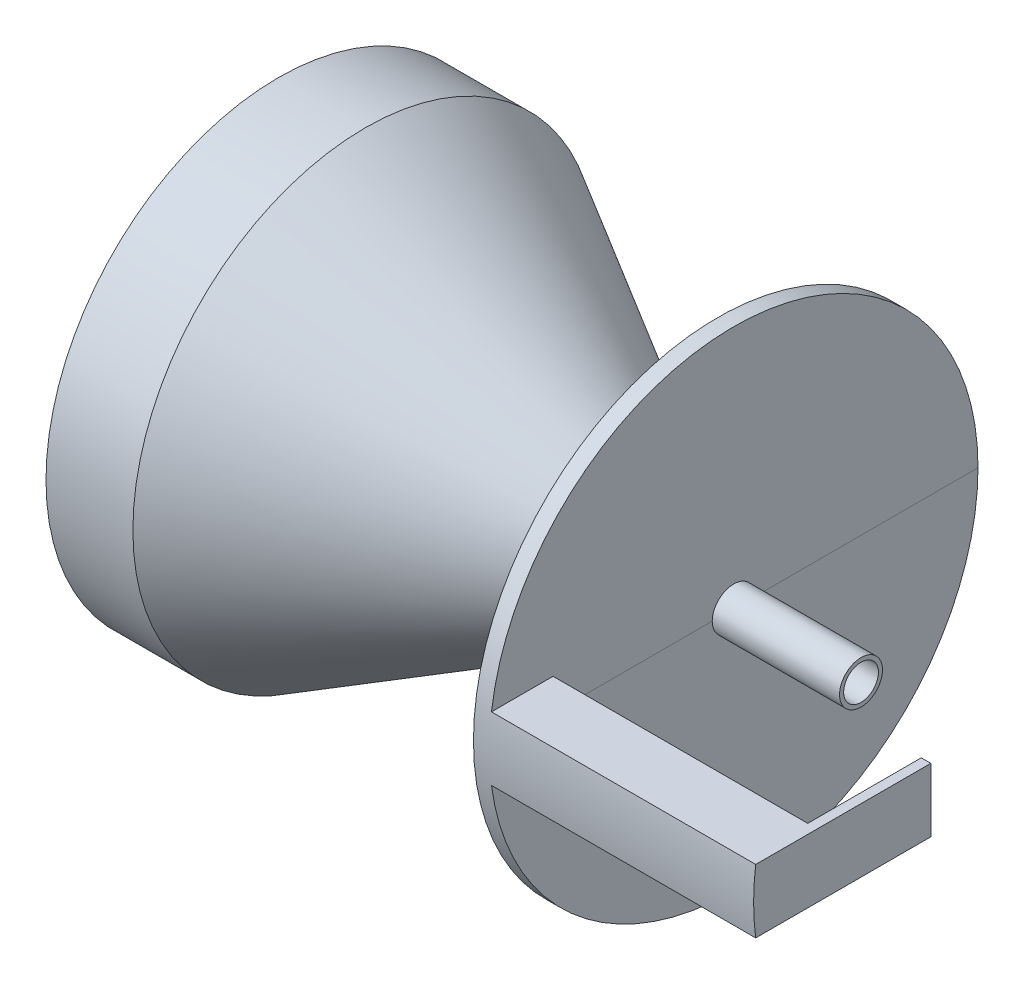
ISO-10303-21;
HEADER;
FILE_DESCRIPTION(('STEP AP214'),'2;1');
FILE_NAME('part.step','',(''),(''),'','','');
FILE_SCHEMA(('AUTOMOTIVE_DESIGN { 1 0 10303 214 1 1 1 1 }'));
ENDSEC;
DATA;
#1=APPLICATION_CONTEXT('core data for automotive mechanical design processes');
#2=APPLICATION_PROTOCOL_DEFINITION('international standard','automotive_design',2000,#1);
#3=PRODUCT_CONTEXT('',#1,'mechanical');
#4=PRODUCT('Part','Part','',(#3));
#5=PRODUCT_RELATED_PRODUCT_CATEGORY('part','',(#4));
#6=PRODUCT_DEFINITION_FORMATION('','',#4);
#7=PRODUCT_DEFINITION_CONTEXT('part definition',#1,'design');
#8=PRODUCT_DEFINITION('design','',#6,#7);
#9=PRODUCT_DEFINITION_SHAPE('','',#8);
#10=(LENGTH_UNIT() NAMED_UNIT(*) SI_UNIT(.MILLI.,.METRE.));
#11=(NAMED_UNIT(*) PLANE_ANGLE_UNIT() SI_UNIT($,.RADIAN.));
#12=(NAMED_UNIT(*) SI_UNIT($,.STERADIAN.) SOLID_ANGLE_UNIT());
#13=UNCERTAINTY_MEASURE_WITH_UNIT(LENGTH_MEASURE(1.E-05),#10,'distance_accuracy_value','');
#14=(GEOMETRIC_REPRESENTATION_CONTEXT(3) GLOBAL_UNCERTAINTY_ASSIGNED_CONTEXT((#13)) GLOBAL_UNIT_ASSIGNED_CONTEXT((#10,
#11,#12)) REPRESENTATION_CONTEXT('',''));
#15=CARTESIAN_POINT('',(0.,0.,0.));
#16=DIRECTION('',(0.,0.,1.));
#17=DIRECTION('',(1.,0.,0.));
#18=AXIS2_PLACEMENT_3D('',#15,#16,#17);
#19=CARTESIAN_POINT('',(143.,0.,6.73913217343127));
#20=DIRECTION('',(1.,0.,0.));
#21=DIRECTION('',(0.,0.,-1.));
#22=AXIS2_PLACEMENT_3D('',#19,#20,#21);
#23=PLANE('',#22);
#24=DIRECTION('',(0.,0.,1.));
#25=VECTOR('',#24,1.);
#26=CARTESIAN_POINT('',(143.,0.,6.73913217343127));
#27=LINE('',#26,#25);
#28=CARTESIAN_POINT('',(143.,0.,6.73913217343127));
#29=VERTEX_POINT('',#28);
#30=CARTESIAN_POINT('',(143.,0.,56.7391321734313));
#31=VERTEX_POINT('',#30);
#32=EDGE_CURVE('E198',#29,#31,#27,.T.);
#33=ORIENTED_EDGE('',*,*,#32,.T.);
#34=DIRECTION('',(0.,1.,0.));
#35=VECTOR('',#34,1.);
#36=CARTESIAN_POINT('',(143.,0.,56.7391321734313));
#37=LINE('',#36,#35);
#38=CARTESIAN_POINT('',(143.,-10.,56.7391321734313));
#39=VERTEX_POINT('',#38);
#40=EDGE_CURVE('E71',#39,#31,#37,.T.);
#41=ORIENTED_EDGE('',*,*,#40,.F.);
#42=DIRECTION('',(0.,0.,-1.));
#43=VECTOR('',#42,1.);
#44=CARTESIAN_POINT('',(143.,-10.,56.7391321734313));
#45=LINE('',#44,#43);
#46=CARTESIAN_POINT('',(143.,-10.,76.0847843312403));
#47=VERTEX_POINT('',#46);
#48=EDGE_CURVE('E182',#47,#39,#45,.T.);
#49=ORIENTED_EDGE('',*,*,#48,.F.);
#50=CARTESIAN_POINT('',(143.,0.,0.));
#51=DIRECTION('',(1.,0.,0.));
#52=DIRECTION('',(0.,0.,1.));
#53=AXIS2_PLACEMENT_3D('',#50,#51,#52);
#54=CIRCLE('',#53,76.7391321734313);
#55=CARTESIAN_POINT('',(143.,0.,-76.7391321734313));
#56=VERTEX_POINT('',#55);
#57=EDGE_CURVE('E143',#47,#56,#54,.T.);
#58=ORIENTED_EDGE('',*,*,#57,.T.);
#59=DIRECTION('',(0.,0.,-1.));
#60=VECTOR('',#59,1.);
#61=CARTESIAN_POINT('',(143.,0.,-6.73913217343127));
#62=LINE('',#61,#60);
#63=CARTESIAN_POINT('',(143.,0.,-6.73913217343127));
#64=VERTEX_POINT('',#63);
#65=EDGE_CURVE('E194',#64,#56,#62,.T.);
#66=ORIENTED_EDGE('',*,*,#65,.F.);
#67=CARTESIAN_POINT('',(143.,0.,0.));
#68=DIRECTION('',(1.,0.,0.));
#69=DIRECTION('',(0.,0.,1.));
#70=AXIS2_PLACEMENT_3D('',#67,#68,#69);
#71=CIRCLE('',#70,6.73913217343127);
#72=EDGE_CURVE('E200',#29,#64,#71,.T.);
#73=ORIENTED_EDGE('',*,*,#72,.F.);
#74=EDGE_LOOP('',(#33,#41,#49,#58,#66,#73));
#75=FACE_BOUND('',#74,.T.);
#76=ADVANCED_FACE('F48',(#75),#23,.T.);
#77=CARTESIAN_POINT('',(143.,0.,-6.73913217343127));
#78=DIRECTION('',(1.,0.,0.));
#79=DIRECTION('',(0.,0.,-1.));
#80=AXIS2_PLACEMENT_3D('',#77,#78,#79);
#81=PLANE('',#80);
#82=DIRECTION('',(0.,0.,1.));
#83=VECTOR('',#82,1.);
#84=CARTESIAN_POINT('',(143.,10.,56.7391321734313));
#85=LINE('',#84,#83);
#86=CARTESIAN_POINT('',(143.,10.,56.7391321734313));
#87=VERTEX_POINT('',#86);
#88=CARTESIAN_POINT('',(143.,10.,76.0847843312403));
#89=VERTEX_POINT('',#88);
#90=EDGE_CURVE('E184',#87,#89,#85,.T.);
#91=ORIENTED_EDGE('',*,*,#90,.F.);
#92=DIRECTION('',(0.,-1.,0.));
#93=VECTOR('',#92,1.);
#94=CARTESIAN_POINT('',(143.,0.,56.7391321734313));
#95=LINE('',#94,#93);
#96=EDGE_CURVE('E12',#87,#31,#95,.T.);
#97=ORIENTED_EDGE('',*,*,#96,.T.);
#98=ORIENTED_EDGE('',*,*,#32,.F.);
#99=CARTESIAN_POINT('',(143.,0.,0.));
#100=DIRECTION('',(-1.,0.,0.));
#101=DIRECTION('',(0.,0.,1.));
#102=AXIS2_PLACEMENT_3D('',#99,#100,#101);
#103=CIRCLE('',#102,6.73913217343127);
#104=EDGE_CURVE('E234',#29,#64,#103,.T.);
#105=ORIENTED_EDGE('',*,*,#104,.T.);
#106=ORIENTED_EDGE('',*,*,#65,.T.);
#107=CARTESIAN_POINT('',(143.,0.,0.));
#108=DIRECTION('',(1.,0.,0.));
#109=DIRECTION('',(0.,0.,-1.));
#110=AXIS2_PLACEMENT_3D('',#107,#108,#109);
#111=CIRCLE('',#110,76.7391321734313);
#112=EDGE_CURVE('E210',#56,#89,#111,.T.);
#113=ORIENTED_EDGE('',*,*,#112,.T.);
#114=EDGE_LOOP('',(#91,#97,#98,#105,#106,#113));
#115=FACE_BOUND('',#114,.T.);
#116=ADVANCED_FACE('F277',(#115),#81,.T.);
#117=CARTESIAN_POINT('',(141.490801074267,0.,0.));
#118=DIRECTION('',(-1.,0.,0.));
#119=DIRECTION('',(0.,0.,1.));
#120=AXIS2_PLACEMENT_3D('',#117,#118,#119);
#121=CONICAL_SURFACE('',#120,7.60336554424563,0.520061711616792);
#122=CARTESIAN_POINT('',(138.,0.,0.));
#123=DIRECTION('',(1.,0.,0.));
#124=DIRECTION('',(0.,0.,-1.));
#125=AXIS2_PLACEMENT_3D('',#122,#123,#124);
#126=CIRCLE('',#125,9.60235105093749);
#127=CARTESIAN_POINT('',(138.,0.,-9.60235105093751));
#128=VERTEX_POINT('',#127);
#129=CARTESIAN_POINT('',(138.,0.,9.60235105093749));
#130=VERTEX_POINT('',#129);
#131=EDGE_CURVE('E195',#128,#130,#126,.T.);
#132=ORIENTED_EDGE('',*,*,#131,.F.);
#133=CARTESIAN_POINT('',(138.,0.,0.));
#134=DIRECTION('',(1.,0.,0.));
#135=DIRECTION('',(0.,0.,1.));
#136=AXIS2_PLACEMENT_3D('',#133,#134,#135);
#137=CIRCLE('',#136,9.60235105093749);
#138=EDGE_CURVE('E202',#130,#128,#137,.T.);
#139=ORIENTED_EDGE('',*,*,#138,.F.);
#140=EDGE_LOOP('',(#132,#139));
#141=FACE_BOUND('',#140,.T.);
#142=CARTESIAN_POINT('',(27.2895519669807,0.,0.));
#143=DIRECTION('',(-1.,0.,0.));
#144=DIRECTION('',(0.,0.,1.));
#145=AXIS2_PLACEMENT_3D('',#142,#143,#144);
#146=CIRCLE('',#145,73.);
#147=CARTESIAN_POINT('',(27.2895519669807,0.,73.));
#148=VERTEX_POINT('',#147);
#149=EDGE_CURVE('E249',#148,#148,#146,.T.);
#150=ORIENTED_EDGE('',*,*,#149,.F.);
#151=EDGE_LOOP('',(#150));
#152=FACE_BOUND('',#151,.T.);
#153=ADVANCED_FACE('F282',(#141,#152),#121,.T.);
#154=CARTESIAN_POINT('',(0.,0.,0.));
#155=DIRECTION('',(-1.,0.,0.));
#156=DIRECTION('',(0.,0.,1.));
#157=AXIS2_PLACEMENT_3D('',#154,#155,#156);
#158=PLANE('',#157);
#159=CARTESIAN_POINT('',(0.,0.,0.));
#160=DIRECTION('',(-1.,0.,0.));
#161=DIRECTION('',(0.,0.,1.));
#162=AXIS2_PLACEMENT_3D('',#159,#160,#161);
#163=CIRCLE('',#162,70.);
#164=CARTESIAN_POINT('',(0.,0.,70.));
#165=VERTEX_POINT('',#164);
#166=EDGE_CURVE('E246',#165,#165,#163,.T.);
#167=ORIENTED_EDGE('',*,*,#166,.F.);
#168=EDGE_LOOP('',(#167));
#169=FACE_BOUND('',#168,.T.);
#170=CARTESIAN_POINT('',(0.,0.,0.));
#171=DIRECTION('',(-1.,0.,0.));
#172=DIRECTION('',(0.,0.,1.));
#173=AXIS2_PLACEMENT_3D('',#170,#171,#172);
#174=CIRCLE('',#173,73.);
#175=CARTESIAN_POINT('',(0.,0.,73.));
#176=VERTEX_POINT('',#175);
#177=EDGE_CURVE('E57',#176,#176,#174,.T.);
#178=ORIENTED_EDGE('',*,*,#177,.T.);
#179=EDGE_LOOP('',(#178));
#180=FACE_BOUND('',#179,.T.);
#181=ADVANCED_FACE('F500',(#169,#180),#158,.T.);
#182=CARTESIAN_POINT('',(0.,0.,0.));
#183=DIRECTION('',(-1.,0.,0.));
#184=DIRECTION('',(0.,0.,1.));
#185=AXIS2_PLACEMENT_3D('',#182,#183,#184);
#186=CYLINDRICAL_SURFACE('',#185,73.);
#187=ORIENTED_EDGE('',*,*,#177,.F.);
#188=EDGE_LOOP('',(#187));
#189=FACE_BOUND('',#188,.T.);
#190=ORIENTED_EDGE('',*,*,#149,.T.);
#191=EDGE_LOOP('',(#190));
#192=FACE_BOUND('',#191,.T.);
#193=ADVANCED_FACE('F50',(#189,#192),#186,.T.);
#194=CARTESIAN_POINT('',(140.,0.,0.));
#195=DIRECTION('',(-1.,0.,0.));
#196=DIRECTION('',(0.,0.,1.));
#197=AXIS2_PLACEMENT_3D('',#194,#195,#196);
#198=CONICAL_SURFACE('',#197,5.,0.520061711616792);
#199=CARTESIAN_POINT('',(139.333109308548,0.,0.));
#200=DIRECTION('',(-1.,0.,0.));
#201=DIRECTION('',(0.,0.,1.));
#202=AXIS2_PLACEMENT_3D('',#199,#200,#201);
#203=CIRCLE('',#202,5.38189080339985);
#204=CARTESIAN_POINT('',(139.333109308548,0.,5.38189080339983));
#205=VERTEX_POINT('',#204);
#206=EDGE_CURVE('E240',#205,#205,#203,.T.);
#207=CARTESIAN_POINT('',(26.4913882228015,0.,0.));
#208=DIRECTION('',(-1.,0.,0.));
#209=DIRECTION('',(0.,0.,1.));
#210=AXIS2_PLACEMENT_3D('',#207,#208,#209);
#211=CIRCLE('',#210,70.);
#212=CARTESIAN_POINT('',(26.4913882228015,0.,70.));
#213=VERTEX_POINT('',#212);
#214=EDGE_CURVE('E243',#213,#213,#211,.T.);
#215=CARTESIAN_POINT('',(139.333109308548,0.,5.38189080339983));
#216=CARTESIAN_POINT('',(138.157674713905,0.,6.05499610753108));
#217=CARTESIAN_POINT('',(136.982240119261,0.,6.72810141166233));
#218=CARTESIAN_POINT('',(134.631370929975,0.,8.07431201992484));
#219=CARTESIAN_POINT('',(133.455936335332,0.,8.74741732405609));
#220=CARTESIAN_POINT('',(131.105067146045,0.,10.0936279323186));
#221=CARTESIAN_POINT('',(129.929632551402,0.,10.7667332364498));
#222=CARTESIAN_POINT('',(127.578763362116,0.,12.1129438447124));
#223=CARTESIAN_POINT('',(126.403328767473,0.,12.7860491488436));
#224=CARTESIAN_POINT('',(124.052459578186,0.,14.1322597571061));
#225=CARTESIAN_POINT('',(122.877024983543,0.,14.8053650612374));
#226=CARTESIAN_POINT('',(120.526155794257,0.,16.1515756694999));
#227=CARTESIAN_POINT('',(119.350721199614,0.,16.8246809736311));
#228=CARTESIAN_POINT('',(116.999852010327,0.,18.1708915818936));
#229=CARTESIAN_POINT('',(115.824417415684,0.,18.8439968860249));
#230=CARTESIAN_POINT('',(113.473548226398,0.,20.1902074942874));
#231=CARTESIAN_POINT('',(112.298113631754,0.,20.8633127984186));
#232=CARTESIAN_POINT('',(109.947244442468,0.,22.2095234066811));
#233=CARTESIAN_POINT('',(108.771809847825,0.,22.8826287108124));
#234=CARTESIAN_POINT('',(106.420940658538,0.,24.2288393190749));
#235=CARTESIAN_POINT('',(105.245506063895,0.,24.9019446232061));
#236=CARTESIAN_POINT('',(102.894636874609,0.,26.2481552314686));
#237=CARTESIAN_POINT('',(101.719202279966,0.,26.9212605355999));
#238=CARTESIAN_POINT('',(99.3683330906793,0.,28.2674711438624));
#239=CARTESIAN_POINT('',(98.1928984960361,0.,28.9405764479936));
#240=CARTESIAN_POINT('',(95.8420293067498,0.,30.2867870562562));
#241=CARTESIAN_POINT('',(94.6665947121065,0.,30.9598923603874));
#242=CARTESIAN_POINT('',(92.3157255228202,0.,32.3061029686499));
#243=CARTESIAN_POINT('',(91.140290928177,0.,32.9792082727812));
#244=CARTESIAN_POINT('',(88.7894217388906,0.,34.3254188810437));
#245=CARTESIAN_POINT('',(87.6139871442474,0.,34.9985241851749));
#246=CARTESIAN_POINT('',(85.263117954961,0.,36.3447347934374));
#247=CARTESIAN_POINT('',(84.0876833603178,0.,37.0178400975687));
#248=CARTESIAN_POINT('',(81.7368141710314,0.,38.3640507058312));
#249=CARTESIAN_POINT('',(80.5613795763882,0.,39.0371560099624));
#250=CARTESIAN_POINT('',(78.2105103871019,0.,40.3833666182249));
#251=CARTESIAN_POINT('',(77.0350757924587,0.,41.0564719223562));
#252=CARTESIAN_POINT('',(74.6842066031723,0.,42.4026825306187));
#253=CARTESIAN_POINT('',(73.5087720085291,0.,43.0757878347499));
#254=CARTESIAN_POINT('',(71.1579028192427,0.,44.4219984430124));
#255=CARTESIAN_POINT('',(69.9824682245995,0.,45.0951037471437));
#256=CARTESIAN_POINT('',(67.6315990353132,0.,46.4413143554062));
#257=CARTESIAN_POINT('',(66.45616444067,0.,47.1144196595374));
#258=CARTESIAN_POINT('',(64.1052952513836,0.,48.4606302677999));
#259=CARTESIAN_POINT('',(62.9298606567404,0.,49.1337355719312));
#260=CARTESIAN_POINT('',(60.578991467454,0.,50.4799461801937));
#261=CARTESIAN_POINT('',(59.4035568728108,0.,51.153051484325));
#262=CARTESIAN_POINT('',(57.0526876835244,0.,52.4992620925875));
#263=CARTESIAN_POINT('',(55.8772530888812,0.,53.1723673967187));
#264=CARTESIAN_POINT('',(53.5263838995949,0.,54.5185780049812));
#265=CARTESIAN_POINT('',(52.3509493049517,0.,55.1916833091125));
#266=CARTESIAN_POINT('',(50.0000801156653,0.,56.537893917375));
#267=CARTESIAN_POINT('',(48.8246455210221,0.,57.2109992215062));
#268=CARTESIAN_POINT('',(46.4737763317357,0.,58.5572098297687));
#269=CARTESIAN_POINT('',(45.2983417370925,0.,59.2303151339));
#270=CARTESIAN_POINT('',(42.9474725478061,0.,60.5765257421625));
#271=CARTESIAN_POINT('',(41.772037953163,0.,61.2496310462937));
#272=CARTESIAN_POINT('',(39.4211687638766,0.,62.5958416545562));
#273=CARTESIAN_POINT('',(38.2457341692334,0.,63.2689469586875));
#274=CARTESIAN_POINT('',(35.894864979947,0.,64.61515756695));
#275=CARTESIAN_POINT('',(34.7194303853038,0.,65.2882628710812));
#276=CARTESIAN_POINT('',(32.3685611960174,0.,66.6344734793437));
#277=CARTESIAN_POINT('',(31.1931266013742,0.,67.307578783475));
#278=CARTESIAN_POINT('',(28.8422574120879,0.,68.6537893917375));
#279=CARTESIAN_POINT('',(27.6668228174447,0.,69.3268946958688));
#280=CARTESIAN_POINT('',(26.4913882228015,0.,70.));
#281=B_SPLINE_CURVE_WITH_KNOTS('',3,(#215,#216,#217,#218,#219,#220,#221,#222,#223,#224,#225,
#226,#227,#228,#229,#230,#231,#232,#233,#234,#235,#236,#237,#238,#239,#240,#241,#242,#243,#244,
#245,#246,#247,#248,#249,#250,#251,#252,#253,#254,#255,#256,#257,#258,#259,#260,#261,#262,#263,
#264,#265,#266,#267,#268,#269,#270,#271,#272,#273,#274,#275,#276,#277,#278,#279,#280),
.UNSPECIFIED.,.F.,.F.,(4,2,2,2,2,2,2,2,2,2,2,2,2,2,2,2,2,2,2,2,2,2,2,2,2,2,2,2,2,2,2,2,4),(0.,
4.0635520337019,8.12710406740377,12.1906561011056,16.2542081348075,20.3177601685094,
24.3813122022113,28.4448642359131,32.508416269615,36.5719683033169,40.6355203370188,
44.6990723707206,48.7626244044225,52.8261764381244,56.8897284718263,60.9532805055281,
65.01683253923,69.0803845729319,73.1439366066338,77.2074886403357,81.2710406740375,
85.3345927077394,89.3981447414413,93.4616967751432,97.525248808845,101.588800842547,
105.652352876249,109.715904909951,113.779456943653,117.843008977354,121.906561011056,
125.970113044758,130.03366507846),.UNSPECIFIED.);
#282=EDGE_CURVE('BSEAM260',#205,#213,#281,.T.);
#283=ORIENTED_EDGE('',*,*,#206,.F.);
#284=ORIENTED_EDGE('',*,*,#214,.T.);
#285=ORIENTED_EDGE('',*,*,#282,.T.);
#286=ORIENTED_EDGE('',*,*,#282,.F.);
#287=EDGE_LOOP('',(#283,#285,#284,#286));
#288=FACE_BOUND('',#287,.T.);
#289=ADVANCED_FACE('F260',(#288),#198,.F.);
#290=CARTESIAN_POINT('',(0.,0.,0.));
#291=DIRECTION('',(-1.,0.,0.));
#292=DIRECTION('',(0.,0.,1.));
#293=AXIS2_PLACEMENT_3D('',#290,#291,#292);
#294=CYLINDRICAL_SURFACE('',#293,70.);
#295=ORIENTED_EDGE('',*,*,#166,.T.);
#296=EDGE_LOOP('',(#295));
#297=FACE_BOUND('',#296,.T.);
#298=ORIENTED_EDGE('',*,*,#214,.F.);
#299=EDGE_LOOP('',(#298));
#300=FACE_BOUND('',#299,.T.);
#301=ADVANCED_FACE('F263',(#297,#300),#294,.F.);
#302=CARTESIAN_POINT('',(133.,0.,0.));
#303=DIRECTION('',(1.,0.,0.));
#304=DIRECTION('',(0.,0.,-1.));
#305=AXIS2_PLACEMENT_3D('',#302,#303,#304);
#306=CYLINDRICAL_SURFACE('',#305,5.38189080339985);
#307=ORIENTED_EDGE('',*,*,#206,.T.);
#308=EDGE_LOOP('',(#307));
#309=FACE_BOUND('',#308,.T.);
#310=CARTESIAN_POINT('',(143.,0.,0.));
#311=DIRECTION('',(1.,0.,0.));
#312=DIRECTION('',(0.,0.,-1.));
#313=AXIS2_PLACEMENT_3D('',#310,#311,#312);
#314=CIRCLE('',#313,5.38189080339985);
#315=CARTESIAN_POINT('',(143.,0.,-5.38189080339985));
#316=VERTEX_POINT('',#315);
#317=EDGE_CURVE('E231',#316,#316,#314,.T.);
#318=ORIENTED_EDGE('',*,*,#317,.T.);
#319=EDGE_LOOP('',(#318));
#320=FACE_BOUND('',#319,.T.);
#321=ADVANCED_FACE('F257',(#309,#320),#306,.F.);
#322=CARTESIAN_POINT('',(183.,0.,0.));
#323=DIRECTION('',(-1.,0.,0.));
#324=DIRECTION('',(0.,0.,1.));
#325=AXIS2_PLACEMENT_3D('',#322,#323,#324);
#326=PLANE('',#325);
#327=CARTESIAN_POINT('',(183.,0.,0.));
#328=DIRECTION('',(1.,0.,0.));
#329=DIRECTION('',(0.,0.,-1.));
#330=AXIS2_PLACEMENT_3D('',#327,#328,#329);
#331=CIRCLE('',#330,5.45925134633352);
#332=CARTESIAN_POINT('',(183.,0.,-5.45925134633352));
#333=VERTEX_POINT('',#332);
#334=EDGE_CURVE('E228',#333,#333,#331,.T.);
#335=ORIENTED_EDGE('',*,*,#334,.F.);
#336=EDGE_LOOP('',(#335));
#337=FACE_BOUND('',#336,.T.);
#338=CARTESIAN_POINT('',(183.,0.,0.));
#339=DIRECTION('',(-1.,0.,0.));
#340=DIRECTION('',(0.,0.,1.));
#341=AXIS2_PLACEMENT_3D('',#338,#339,#340);
#342=CIRCLE('',#341,6.73913217343127);
#343=CARTESIAN_POINT('',(183.,0.,6.73913217343127));
#344=VERTEX_POINT('',#343);
#345=EDGE_CURVE('E237',#344,#344,#342,.T.);
#346=ORIENTED_EDGE('',*,*,#345,.F.);
#347=EDGE_LOOP('',(#346));
#348=FACE_BOUND('',#347,.T.);
#349=ADVANCED_FACE('F273',(#337,#348),#326,.F.);
#350=CARTESIAN_POINT('',(143.,0.,0.));
#351=DIRECTION('',(1.,0.,0.));
#352=DIRECTION('',(0.,0.,-1.));
#353=AXIS2_PLACEMENT_3D('',#350,#351,#352);
#354=CYLINDRICAL_SURFACE('',#353,6.73913217343127);
#355=ORIENTED_EDGE('',*,*,#345,.T.);
#356=EDGE_LOOP('',(#355));
#357=FACE_BOUND('',#356,.T.);
#358=ORIENTED_EDGE('',*,*,#104,.F.);
#359=ORIENTED_EDGE('',*,*,#72,.T.);
#360=EDGE_LOOP('',(#358,#359));
#361=FACE_BOUND('',#360,.T.);
#362=ADVANCED_FACE('F275',(#357,#361),#354,.T.);
#363=CARTESIAN_POINT('',(183.,0.,0.));
#364=DIRECTION('',(-1.,0.,0.));
#365=DIRECTION('',(0.,0.,1.));
#366=AXIS2_PLACEMENT_3D('',#363,#364,#365);
#367=CYLINDRICAL_SURFACE('',#366,5.45925134633352);
#368=ORIENTED_EDGE('',*,*,#334,.T.);
#369=EDGE_LOOP('',(#368));
#370=FACE_BOUND('',#369,.T.);
#371=CARTESIAN_POINT('',(143.,0.,0.));
#372=DIRECTION('',(1.,0.,0.));
#373=DIRECTION('',(0.,0.,-1.));
#374=AXIS2_PLACEMENT_3D('',#371,#372,#373);
#375=CIRCLE('',#374,5.45925134633352);
#376=CARTESIAN_POINT('',(143.,0.,-5.45925134633352));
#377=VERTEX_POINT('',#376);
#378=EDGE_CURVE('E224',#377,#377,#375,.T.);
#379=ORIENTED_EDGE('',*,*,#378,.F.);
#380=EDGE_LOOP('',(#379));
#381=FACE_BOUND('',#380,.T.);
#382=ADVANCED_FACE('F301',(#370,#381),#367,.F.);
#383=CARTESIAN_POINT('',(143.,0.,0.));
#384=DIRECTION('',(1.,0.,0.));
#385=DIRECTION('',(0.,0.,-1.));
#386=AXIS2_PLACEMENT_3D('',#383,#384,#385);
#387=PLANE('',#386);
#388=ORIENTED_EDGE('',*,*,#317,.F.);
#389=EDGE_LOOP('',(#388));
#390=FACE_BOUND('',#389,.T.);
#391=ORIENTED_EDGE('',*,*,#378,.T.);
#392=EDGE_LOOP('',(#391));
#393=FACE_BOUND('',#392,.T.);
#394=ADVANCED_FACE('F297',(#390,#393),#387,.T.);
#395=CARTESIAN_POINT('',(138.,0.,76.7391321734313));
#396=DIRECTION('',(-1.,0.,0.));
#397=DIRECTION('',(0.,0.,1.));
#398=AXIS2_PLACEMENT_3D('',#395,#396,#397);
#399=PLANE('',#398);
#400=DIRECTION('',(0.,0.,-1.));
#401=VECTOR('',#400,1.);
#402=CARTESIAN_POINT('',(138.,0.,76.7391321734313));
#403=LINE('',#402,#401);
#404=CARTESIAN_POINT('',(138.,0.,76.7391321734313));
#405=VERTEX_POINT('',#404);
#406=CARTESIAN_POINT('',(138.,0.,75.6733318051499));
#407=VERTEX_POINT('',#406);
#408=EDGE_CURVE('E205',#405,#407,#403,.T.);
#409=ORIENTED_EDGE('',*,*,#408,.T.);
#410=CARTESIAN_POINT('',(138.,0.,67.0573974802437));
#411=DIRECTION('',(-1.,0.,0.));
#412=DIRECTION('',(0.,0.,1.));
#413=AXIS2_PLACEMENT_3D('',#410,#411,#412);
#414=CIRCLE('',#413,8.61593432490615);
#415=CARTESIAN_POINT('',(138.,0.,58.4414631553376));
#416=VERTEX_POINT('',#415);
#417=EDGE_CURVE('E63',#407,#416,#414,.F.);
#418=ORIENTED_EDGE('',*,*,#417,.T.);
#419=EDGE_CURVE('E222',#416,#130,#403,.T.);
#420=ORIENTED_EDGE('',*,*,#419,.T.);
#421=ORIENTED_EDGE('',*,*,#138,.T.);
#422=DIRECTION('',(0.,0.,1.));
#423=VECTOR('',#422,1.);
#424=CARTESIAN_POINT('',(138.,0.,-76.7391321734313));
#425=LINE('',#424,#423);
#426=CARTESIAN_POINT('',(138.,0.,-76.7391321734313));
#427=VERTEX_POINT('',#426);
#428=EDGE_CURVE('E199',#427,#128,#425,.T.);
#429=ORIENTED_EDGE('',*,*,#428,.F.);
#430=CARTESIAN_POINT('',(138.,0.,0.));
#431=DIRECTION('',(1.,0.,0.));
#432=DIRECTION('',(0.,0.,1.));
#433=AXIS2_PLACEMENT_3D('',#430,#431,#432);
#434=CIRCLE('',#433,76.7391321734313);
#435=EDGE_CURVE('E214',#405,#427,#434,.T.);
#436=ORIENTED_EDGE('',*,*,#435,.F.);
#437=EDGE_LOOP('',(#409,#418,#420,#421,#429,#436));
#438=FACE_BOUND('',#437,.T.);
#439=ADVANCED_FACE('F290',(#438),#399,.T.);
#440=CARTESIAN_POINT('',(143.,0.,0.));
#441=DIRECTION('',(1.,0.,0.));
#442=DIRECTION('',(0.,0.,-1.));
#443=AXIS2_PLACEMENT_3D('',#440,#441,#442);
#444=CYLINDRICAL_SURFACE('',#443,76.7391321734313);
#445=ORIENTED_EDGE('',*,*,#57,.F.);
#446=DIRECTION('',(-1.,0.,0.));
#447=VECTOR('',#446,1.);
#448=CARTESIAN_POINT('',(223.,-10.,76.0847843312403));
#449=LINE('',#448,#447);
#450=CARTESIAN_POINT('',(226.,-10.,76.0847843312403));
#451=VERTEX_POINT('',#450);
#452=EDGE_CURVE('E136',#451,#47,#449,.T.);
#453=ORIENTED_EDGE('',*,*,#452,.F.);
#454=CARTESIAN_POINT('',(226.,0.,-1.2490009027033E-12));
#455=DIRECTION('',(1.,0.,0.));
#456=DIRECTION('',(0.,0.,1.));
#457=AXIS2_PLACEMENT_3D('',#454,#455,#456);
#458=CIRCLE('',#457,76.7391321734325);
#459=CARTESIAN_POINT('',(226.,10.,76.0847843312403));
#460=VERTEX_POINT('',#459);
#461=EDGE_CURVE('E141',#460,#451,#458,.T.);
#462=ORIENTED_EDGE('',*,*,#461,.F.);
#463=DIRECTION('',(-1.,0.,0.));
#464=VECTOR('',#463,1.);
#465=CARTESIAN_POINT('',(223.,10.,76.0847843312403));
#466=LINE('',#465,#464);
#467=EDGE_CURVE('E145',#460,#89,#466,.T.);
#468=ORIENTED_EDGE('',*,*,#467,.T.);
#469=ORIENTED_EDGE('',*,*,#112,.F.);
#470=DIRECTION('',(-1.,0.,0.));
#471=VECTOR('',#470,1.);
#472=CARTESIAN_POINT('',(143.,0.,-76.7391321734313));
#473=LINE('',#472,#471);
#474=EDGE_CURVE('E208',#56,#427,#473,.T.);
#475=ORIENTED_EDGE('',*,*,#474,.T.);
#476=CARTESIAN_POINT('',(138.,0.,0.));
#477=DIRECTION('',(1.,0.,0.));
#478=DIRECTION('',(0.,0.,-1.));
#479=AXIS2_PLACEMENT_3D('',#476,#477,#478);
#480=CIRCLE('',#479,76.7391321734313);
#481=EDGE_CURVE('E219',#427,#405,#480,.T.);
#482=ORIENTED_EDGE('',*,*,#481,.T.);
#483=DIRECTION('',(-1.,0.,0.));
#484=VECTOR('',#483,1.);
#485=CARTESIAN_POINT('',(143.,0.,76.7391321734313));
#486=LINE('',#485,#484);
#487=CARTESIAN_POINT('',(143.,0.,76.7391321734313));
#488=VERTEX_POINT('',#487);
#489=EDGE_CURVE('E212',#488,#405,#486,.T.);
#490=ORIENTED_EDGE('',*,*,#489,.F.);
#491=ORIENTED_EDGE('',*,*,#489,.T.);
#492=ORIENTED_EDGE('',*,*,#435,.T.);
#493=ORIENTED_EDGE('',*,*,#474,.F.);
#494=EDGE_LOOP('',(#445,#453,#462,#468,#469,#475,#482,#490,#491,#492,#493));
#495=FACE_BOUND('',#494,.T.);
#496=ADVANCED_FACE('F138',(#495),#444,.T.);
#497=CARTESIAN_POINT('',(138.,0.,-76.7391321734313));
#498=DIRECTION('',(-1.,0.,0.));
#499=DIRECTION('',(0.,0.,1.));
#500=AXIS2_PLACEMENT_3D('',#497,#498,#499);
#501=PLANE('',#500);
#502=ORIENTED_EDGE('',*,*,#419,.F.);
#503=CARTESIAN_POINT('',(138.,0.,67.0573974802437));
#504=DIRECTION('',(-1.,0.,0.));
#505=DIRECTION('',(0.,0.,1.));
#506=AXIS2_PLACEMENT_3D('',#503,#504,#505);
#507=CIRCLE('',#506,8.61593432490615);
#508=EDGE_CURVE('E176',#416,#407,#507,.F.);
#509=ORIENTED_EDGE('',*,*,#508,.T.);
#510=ORIENTED_EDGE('',*,*,#408,.F.);
#511=ORIENTED_EDGE('',*,*,#481,.F.);
#512=ORIENTED_EDGE('',*,*,#428,.T.);
#513=ORIENTED_EDGE('',*,*,#131,.T.);
#514=EDGE_LOOP('',(#502,#509,#510,#511,#512,#513));
#515=FACE_BOUND('',#514,.T.);
#516=ADVANCED_FACE('F289',(#515),#501,.T.);
#517=CARTESIAN_POINT('',(223.,0.,56.7391321734313));
#518=DIRECTION('',(0.,0.,1.));
#519=DIRECTION('',(1.,0.,0.));
#520=AXIS2_PLACEMENT_3D('',#517,#518,#519);
#521=PLANE('',#520);
#522=ORIENTED_EDGE('',*,*,#40,.T.);
#523=ORIENTED_EDGE('',*,*,#96,.F.);
#524=DIRECTION('',(-1.,0.,0.));
#525=VECTOR('',#524,1.);
#526=CARTESIAN_POINT('',(223.,10.,56.7391321734313));
#527=LINE('',#526,#525);
#528=CARTESIAN_POINT('',(223.,10.,56.7391321734313));
#529=VERTEX_POINT('',#528);
#530=EDGE_CURVE('E191',#529,#87,#527,.T.);
#531=ORIENTED_EDGE('',*,*,#530,.F.);
#532=DIRECTION('',(0.,1.,0.));
#533=VECTOR('',#532,1.);
#534=CARTESIAN_POINT('',(223.,0.,56.7391321734313));
#535=LINE('',#534,#533);
#536=CARTESIAN_POINT('',(223.,-10.,56.7391321734313));
#537=VERTEX_POINT('',#536);
#538=EDGE_CURVE('E179',#537,#529,#535,.T.);
#539=ORIENTED_EDGE('',*,*,#538,.F.);
#540=DIRECTION('',(-1.,0.,0.));
#541=VECTOR('',#540,1.);
#542=CARTESIAN_POINT('',(223.,-10.,56.7391321734313));
#543=LINE('',#542,#541);
#544=EDGE_CURVE('E146',#537,#39,#543,.T.);
#545=ORIENTED_EDGE('',*,*,#544,.T.);
#546=EDGE_LOOP('',(#522,#523,#531,#539,#545));
#547=FACE_BOUND('',#546,.T.);
#548=ADVANCED_FACE('F293',(#547),#521,.F.);
#549=CARTESIAN_POINT('',(223.,10.,56.7391321734313));
#550=DIRECTION('',(0.,-1.,0.));
#551=DIRECTION('',(0.,0.,-1.));
#552=AXIS2_PLACEMENT_3D('',#549,#550,#551);
#553=PLANE('',#552);
#554=ORIENTED_EDGE('',*,*,#90,.T.);
#555=ORIENTED_EDGE('',*,*,#467,.F.);
#556=DIRECTION('',(0.,0.,1.));
#557=VECTOR('',#556,1.);
#558=CARTESIAN_POINT('',(226.,10.,76.0847843312403));
#559=LINE('',#558,#557);
#560=CARTESIAN_POINT('',(226.,10.,21.0847843312403));
#561=VERTEX_POINT('',#560);
#562=EDGE_CURVE('E160',#561,#460,#559,.T.);
#563=ORIENTED_EDGE('',*,*,#562,.F.);
#564=DIRECTION('',(-1.,0.,0.));
#565=VECTOR('',#564,1.);
#566=CARTESIAN_POINT('',(226.,10.,21.0847843312403));
#567=LINE('',#566,#565);
#568=CARTESIAN_POINT('',(223.,10.,21.0847843312403));
#569=VERTEX_POINT('',#568);
#570=EDGE_CURVE('E169',#561,#569,#567,.T.);
#571=ORIENTED_EDGE('',*,*,#570,.T.);
#572=DIRECTION('',(0.,0.,1.));
#573=VECTOR('',#572,1.);
#574=CARTESIAN_POINT('',(223.,10.,76.0847843312403));
#575=LINE('',#574,#573);
#576=EDGE_CURVE('E161',#569,#529,#575,.T.);
#577=ORIENTED_EDGE('',*,*,#576,.T.);
#578=ORIENTED_EDGE('',*,*,#530,.T.);
#579=EDGE_LOOP('',(#554,#555,#563,#571,#577,#578));
#580=FACE_BOUND('',#579,.T.);
#581=ADVANCED_FACE('F324',(#580),#553,.F.);
#582=CARTESIAN_POINT('',(223.,-10.,56.7391321734313));
#583=DIRECTION('',(0.,1.,0.));
#584=DIRECTION('',(0.,0.,1.));
#585=AXIS2_PLACEMENT_3D('',#582,#583,#584);
#586=PLANE('',#585);
#587=ORIENTED_EDGE('',*,*,#48,.T.);
#588=ORIENTED_EDGE('',*,*,#544,.F.);
#589=DIRECTION('',(0.,0.,-1.));
#590=VECTOR('',#589,1.);
#591=CARTESIAN_POINT('',(223.,-10.,76.0847843312403));
#592=LINE('',#591,#590);
#593=CARTESIAN_POINT('',(223.,-10.,21.0847843312403));
#594=VERTEX_POINT('',#593);
#595=EDGE_CURVE('E170',#537,#594,#592,.T.);
#596=ORIENTED_EDGE('',*,*,#595,.T.);
#597=DIRECTION('',(-1.,0.,0.));
#598=VECTOR('',#597,1.);
#599=CARTESIAN_POINT('',(226.,-10.,21.0847843312403));
#600=LINE('',#599,#598);
#601=CARTESIAN_POINT('',(226.,-10.,21.0847843312403));
#602=VERTEX_POINT('',#601);
#603=EDGE_CURVE('E152',#602,#594,#600,.T.);
#604=ORIENTED_EDGE('',*,*,#603,.F.);
#605=DIRECTION('',(0.,0.,-1.));
#606=VECTOR('',#605,1.);
#607=CARTESIAN_POINT('',(226.,-10.,76.0847843312403));
#608=LINE('',#607,#606);
#609=EDGE_CURVE('E149',#451,#602,#608,.T.);
#610=ORIENTED_EDGE('',*,*,#609,.F.);
#611=ORIENTED_EDGE('',*,*,#452,.T.);
#612=EDGE_LOOP('',(#587,#588,#596,#604,#610,#611));
#613=FACE_BOUND('',#612,.T.);
#614=ADVANCED_FACE('F150',(#613),#586,.F.);
#615=CARTESIAN_POINT('',(233.,0.,67.0573974802437));
#616=DIRECTION('',(-1.,0.,0.));
#617=DIRECTION('',(0.,0.,1.));
#618=AXIS2_PLACEMENT_3D('',#615,#616,#617);
#619=CYLINDRICAL_SURFACE('',#618,8.61593432490615);
#620=ORIENTED_EDGE('',*,*,#508,.F.);
#621=ORIENTED_EDGE('',*,*,#417,.F.);
#622=EDGE_LOOP('',(#620,#621));
#623=FACE_BOUND('',#622,.T.);
#624=CARTESIAN_POINT('',(223.,0.,67.0573974802437));
#625=DIRECTION('',(1.,0.,0.));
#626=DIRECTION('',(0.,0.,-1.));
#627=AXIS2_PLACEMENT_3D('',#624,#625,#626);
#628=CIRCLE('',#627,8.61593432490615);
#629=CARTESIAN_POINT('',(223.,0.,58.4414631553376));
#630=VERTEX_POINT('',#629);
#631=EDGE_CURVE('E52',#630,#630,#628,.F.);
#632=ORIENTED_EDGE('',*,*,#631,.F.);
#633=EDGE_LOOP('',(#632));
#634=FACE_BOUND('',#633,.T.);
#635=ADVANCED_FACE('F340',(#623,#634),#619,.F.);
#636=CARTESIAN_POINT('',(223.,0.,-1.2490009027033E-12));
#637=DIRECTION('',(-1.,0.,0.));
#638=DIRECTION('',(0.,0.,1.));
#639=AXIS2_PLACEMENT_3D('',#636,#637,#638);
#640=PLANE('',#639);
#641=ORIENTED_EDGE('',*,*,#595,.F.);
#642=ORIENTED_EDGE('',*,*,#538,.T.);
#643=ORIENTED_EDGE('',*,*,#576,.F.);
#644=DIRECTION('',(0.,1.,0.));
#645=VECTOR('',#644,1.);
#646=CARTESIAN_POINT('',(223.,-10.,21.0847843312403));
#647=LINE('',#646,#645);
#648=EDGE_CURVE('E164',#594,#569,#647,.T.);
#649=ORIENTED_EDGE('',*,*,#648,.F.);
#650=EDGE_LOOP('',(#641,#642,#643,#649));
#651=FACE_BOUND('',#650,.T.);
#652=ADVANCED_FACE('F330',(#651),#640,.T.);
#653=CARTESIAN_POINT('',(226.,0.,-1.2490009027033E-12));
#654=DIRECTION('',(-1.,0.,0.));
#655=DIRECTION('',(0.,0.,1.));
#656=AXIS2_PLACEMENT_3D('',#653,#654,#655);
#657=PLANE('',#656);
#658=ORIENTED_EDGE('',*,*,#461,.T.);
#659=ORIENTED_EDGE('',*,*,#609,.T.);
#660=DIRECTION('',(0.,1.,0.));
#661=VECTOR('',#660,1.);
#662=CARTESIAN_POINT('',(226.,-10.,21.0847843312403));
#663=LINE('',#662,#661);
#664=EDGE_CURVE('E155',#602,#561,#663,.T.);
#665=ORIENTED_EDGE('',*,*,#664,.T.);
#666=ORIENTED_EDGE('',*,*,#562,.T.);
#667=EDGE_LOOP('',(#658,#659,#665,#666));
#668=FACE_BOUND('',#667,.T.);
#669=ADVANCED_FACE('F158',(#668),#657,.F.);
#670=CARTESIAN_POINT('',(226.,-10.,21.0847843312403));
#671=DIRECTION('',(0.,0.,1.));
#672=DIRECTION('',(1.,0.,0.));
#673=AXIS2_PLACEMENT_3D('',#670,#671,#672);
#674=PLANE('',#673);
#675=ORIENTED_EDGE('',*,*,#648,.T.);
#676=ORIENTED_EDGE('',*,*,#570,.F.);
#677=ORIENTED_EDGE('',*,*,#664,.F.);
#678=ORIENTED_EDGE('',*,*,#603,.T.);
#679=EDGE_LOOP('',(#675,#676,#677,#678));
#680=FACE_BOUND('',#679,.T.);
#681=ADVANCED_FACE('F349',(#680),#674,.F.);
#682=ORIENTED_EDGE('',*,*,#631,.T.);
#683=EDGE_LOOP('',(#682));
#684=FACE_BOUND('',#683,.T.);
#685=ADVANCED_FACE('F347',(#684),#640,.T.);
#686=CLOSED_SHELL('',(#76,#116,#153,#181,#193,#289,#301,#321,#349,#362,#382,#394,#439,#496,#516,
#548,#581,#614,#635,#652,#669,#681,#685));
#687=MANIFOLD_SOLID_BREP('B2',#686);
#688=ADVANCED_BREP_SHAPE_REPRESENTATION('',(#18,#687),#14);
#689=SHAPE_DEFINITION_REPRESENTATION(#9,#688);
ENDSEC;
END-ISO-10303-21;
